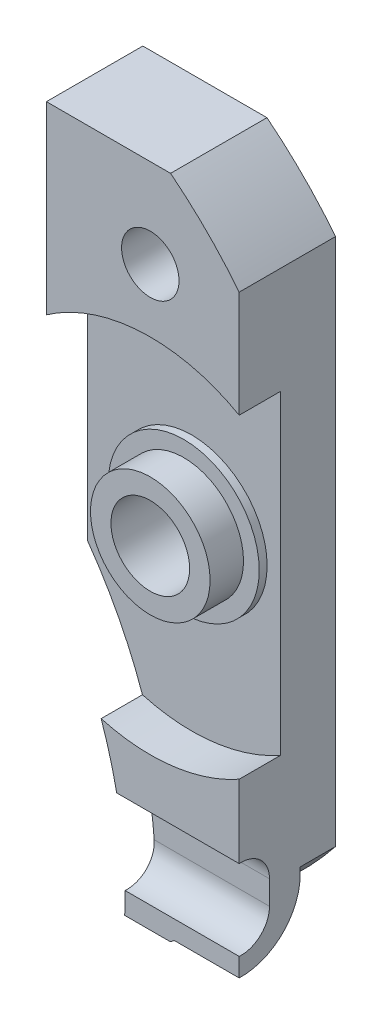
ISO-10303-21;
HEADER;
FILE_DESCRIPTION(('STEP AP214'),'2;1');
FILE_NAME('part.step','',(''),(''),'','','');
FILE_SCHEMA(('AUTOMOTIVE_DESIGN { 1 0 10303 214 1 1 1 1 }'));
ENDSEC;
DATA;
#1=APPLICATION_CONTEXT('core data for automotive mechanical design processes');
#2=APPLICATION_PROTOCOL_DEFINITION('international standard','automotive_design',2000,#1);
#3=PRODUCT_CONTEXT('',#1,'mechanical');
#4=PRODUCT('Part','Part','',(#3));
#5=PRODUCT_RELATED_PRODUCT_CATEGORY('part','',(#4));
#6=PRODUCT_DEFINITION_FORMATION('','',#4);
#7=PRODUCT_DEFINITION_CONTEXT('part definition',#1,'design');
#8=PRODUCT_DEFINITION('design','',#6,#7);
#9=PRODUCT_DEFINITION_SHAPE('','',#8);
#10=(LENGTH_UNIT() NAMED_UNIT(*) SI_UNIT(.MILLI.,.METRE.));
#11=(NAMED_UNIT(*) PLANE_ANGLE_UNIT() SI_UNIT($,.RADIAN.));
#12=(NAMED_UNIT(*) SI_UNIT($,.STERADIAN.) SOLID_ANGLE_UNIT());
#13=UNCERTAINTY_MEASURE_WITH_UNIT(LENGTH_MEASURE(1.E-05),#10,'distance_accuracy_value','');
#14=(GEOMETRIC_REPRESENTATION_CONTEXT(3) GLOBAL_UNCERTAINTY_ASSIGNED_CONTEXT((#13)) GLOBAL_UNIT_ASSIGNED_CONTEXT((#10,
#11,#12)) REPRESENTATION_CONTEXT('',''));
#15=CARTESIAN_POINT('',(0.,0.,0.));
#16=DIRECTION('',(0.,0.,1.));
#17=DIRECTION('',(1.,0.,0.));
#18=AXIS2_PLACEMENT_3D('',#15,#16,#17);
#19=CARTESIAN_POINT('',(0.,0.,6.125));
#20=DIRECTION('',(0.,0.,-1.));
#21=DIRECTION('',(-1.,0.,0.));
#22=AXIS2_PLACEMENT_3D('',#19,#20,#21);
#23=PLANE('',#22);
#24=DIRECTION('',(0.,1.,0.));
#25=VECTOR('',#24,1.);
#26=CARTESIAN_POINT('',(6.125,-21.15,6.125));
#27=LINE('',#26,#25);
#28=CARTESIAN_POINT('',(6.125,-20.9578977025192,6.125));
#29=VERTEX_POINT('',#28);
#30=CARTESIAN_POINT('',(6.125,-19.7692260916635,6.125));
#31=VERTEX_POINT('',#30);
#32=EDGE_CURVE('E281',#29,#31,#27,.T.);
#33=ORIENTED_EDGE('',*,*,#32,.T.);
#34=DIRECTION('',(1.,0.,0.));
#35=VECTOR('',#34,1.);
#36=CARTESIAN_POINT('',(-6.125,-19.7692260916635,6.125));
#37=LINE('',#36,#35);
#38=CARTESIAN_POINT('',(-1.12839404484273,-19.7692260916635,6.125));
#39=VERTEX_POINT('',#38);
#40=EDGE_CURVE('E155',#31,#39,#37,.F.);
#41=ORIENTED_EDGE('',*,*,#40,.T.);
#42=CARTESIAN_POINT('',(-28.1274,-20.00091,6.125));
#43=DIRECTION('',(0.,0.,1.));
#44=DIRECTION('',(1.,0.,0.));
#45=AXIS2_PLACEMENT_3D('',#42,#43,#44);
#46=CIRCLE('',#45,27.);
#47=CARTESIAN_POINT('',(-1.15186307908034,-21.15,6.125));
#48=VERTEX_POINT('',#47);
#49=EDGE_CURVE('E306',#48,#39,#46,.T.);
#50=ORIENTED_EDGE('',*,*,#49,.F.);
#51=DIRECTION('',(1.,0.,0.));
#52=VECTOR('',#51,1.);
#53=CARTESIAN_POINT('',(-6.125,-21.15,6.125));
#54=LINE('',#53,#52);
#55=CARTESIAN_POINT('',(1.75745757507034,-21.15,6.125));
#56=VERTEX_POINT('',#55);
#57=EDGE_CURVE('E276',#48,#56,#54,.T.);
#58=ORIENTED_EDGE('',*,*,#57,.T.);
#59=CARTESIAN_POINT('',(-15.0221,0.00292999999999433,6.125));
#60=DIRECTION('',(0.,0.,-1.));
#61=DIRECTION('',(1.,0.,0.));
#62=AXIS2_PLACEMENT_3D('',#59,#60,#61);
#63=CIRCLE('',#62,27.);
#64=CARTESIAN_POINT('',(1.9968218819908,-20.9578977025192,6.125));
#65=VERTEX_POINT('',#64);
#66=EDGE_CURVE('E355',#65,#56,#63,.T.);
#67=ORIENTED_EDGE('',*,*,#66,.F.);
#68=DIRECTION('',(1.,0.,0.));
#69=VECTOR('',#68,1.);
#70=CARTESIAN_POINT('',(-500000.,-20.9578977025192,6.125));
#71=LINE('',#70,#69);
#72=EDGE_CURVE('E183',#65,#29,#71,.T.);
#73=ORIENTED_EDGE('',*,*,#72,.T.);
#74=EDGE_LOOP('',(#33,#41,#50,#58,#67,#73));
#75=FACE_BOUND('',#74,.T.);
#76=ADVANCED_FACE('F32',(#75),#23,.F.);
#77=CARTESIAN_POINT('',(0.474999999999999,0.,4.));
#78=DIRECTION('',(0.,0.,1.));
#79=DIRECTION('',(1.,0.,0.));
#80=AXIS2_PLACEMENT_3D('',#77,#78,#79);
#81=PLANE('',#80);
#82=CARTESIAN_POINT('',(0.474999999999999,0.,4.));
#83=DIRECTION('',(0.,0.,1.));
#84=DIRECTION('',(1.,0.,0.));
#85=AXIS2_PLACEMENT_3D('',#82,#83,#84);
#86=CIRCLE('',#85,4.8);
#87=CARTESIAN_POINT('',(5.275,0.,4.));
#88=VERTEX_POINT('',#87);
#89=EDGE_CURVE('E394',#88,#88,#86,.T.);
#90=ORIENTED_EDGE('',*,*,#89,.T.);
#91=EDGE_LOOP('',(#90));
#92=FACE_BOUND('',#91,.T.);
#93=CARTESIAN_POINT('',(0.474999999999999,0.,4.));
#94=DIRECTION('',(0.,0.,1.));
#95=DIRECTION('',(1.,0.,0.));
#96=AXIS2_PLACEMENT_3D('',#93,#94,#95);
#97=CIRCLE('',#96,3.8);
#98=CARTESIAN_POINT('',(4.275,0.,4.));
#99=VERTEX_POINT('',#98);
#100=EDGE_CURVE('E387',#99,#99,#97,.T.);
#101=ORIENTED_EDGE('',*,*,#100,.F.);
#102=EDGE_LOOP('',(#101));
#103=FACE_BOUND('',#102,.T.);
#104=ADVANCED_FACE('F246',(#92,#103),#81,.T.);
#105=CARTESIAN_POINT('',(0.474999999999999,0.,3.5));
#106=DIRECTION('',(0.,0.,1.));
#107=DIRECTION('',(1.,0.,0.));
#108=AXIS2_PLACEMENT_3D('',#105,#106,#107);
#109=PLANE('',#108);
#110=DIRECTION('',(0.,1.,0.));
#111=VECTOR('',#110,1.);
#112=CARTESIAN_POINT('',(6.125,-21.15,3.5));
#113=LINE('',#112,#111);
#114=CARTESIAN_POINT('',(6.125,-10.0163616148779,3.5));
#115=VERTEX_POINT('',#114);
#116=CARTESIAN_POINT('',(6.125,10.0163616148779,3.5));
#117=VERTEX_POINT('',#116);
#118=EDGE_CURVE('E365',#115,#117,#113,.T.);
#119=ORIENTED_EDGE('',*,*,#118,.T.);
#120=CARTESIAN_POINT('',(0.474999999999999,0.,3.5));
#121=DIRECTION('',(0.,0.,1.));
#122=DIRECTION('',(1.,0.,0.));
#123=AXIS2_PLACEMENT_3D('',#120,#121,#122);
#124=CIRCLE('',#123,11.5);
#125=CARTESIAN_POINT('',(-6.125,9.4175368329516,3.5));
#126=VERTEX_POINT('',#125);
#127=EDGE_CURVE('E366',#117,#126,#124,.T.);
#128=ORIENTED_EDGE('',*,*,#127,.T.);
#129=DIRECTION('',(0.,-1.,0.));
#130=VECTOR('',#129,1.);
#131=CARTESIAN_POINT('',(-6.125,-21.15,3.5));
#132=LINE('',#131,#130);
#133=CARTESIAN_POINT('',(-6.125,-4.35180797336603,3.5));
#134=VERTEX_POINT('',#133);
#135=EDGE_CURVE('E362',#126,#134,#132,.T.);
#136=ORIENTED_EDGE('',*,*,#135,.T.);
#137=CARTESIAN_POINT('',(-28.1274,-20.00091,3.5));
#138=DIRECTION('',(0.,0.,1.));
#139=DIRECTION('',(1.,0.,0.));
#140=AXIS2_PLACEMENT_3D('',#137,#138,#139);
#141=CIRCLE('',#140,27.);
#142=CARTESIAN_POINT('',(-2.64799421793108,-11.0678320873949,3.5));
#143=VERTEX_POINT('',#142);
#144=EDGE_CURVE('E298',#134,#143,#141,.F.);
#145=ORIENTED_EDGE('',*,*,#144,.T.);
#146=EDGE_CURVE('E369',#143,#115,#124,.T.);
#147=ORIENTED_EDGE('',*,*,#146,.T.);
#148=EDGE_LOOP('',(#119,#128,#136,#145,#147));
#149=FACE_BOUND('',#148,.T.);
#150=CARTESIAN_POINT('',(0.474999999999999,0.,3.5));
#151=DIRECTION('',(0.,0.,1.));
#152=DIRECTION('',(1.,0.,0.));
#153=AXIS2_PLACEMENT_3D('',#150,#151,#152);
#154=CIRCLE('',#153,4.8);
#155=CARTESIAN_POINT('',(5.275,0.,3.5));
#156=VERTEX_POINT('',#155);
#157=EDGE_CURVE('E391',#156,#156,#154,.T.);
#158=ORIENTED_EDGE('',*,*,#157,.F.);
#159=EDGE_LOOP('',(#158));
#160=FACE_BOUND('',#159,.T.);
#161=ADVANCED_FACE('F251',(#149,#160),#109,.T.);
#162=CARTESIAN_POINT('',(0.474999999999999,15.5,6.125));
#163=DIRECTION('',(0.,0.,1.));
#164=DIRECTION('',(1.,0.,0.));
#165=AXIS2_PLACEMENT_3D('',#162,#163,#164);
#166=CIRCLE('',#165,1.825);
#167=CARTESIAN_POINT('',(2.3,15.5,6.125));
#168=VERTEX_POINT('',#167);
#169=EDGE_CURVE('E264',#168,#168,#166,.T.);
#170=ORIENTED_EDGE('',*,*,#169,.F.);
#171=EDGE_LOOP('',(#170));
#172=FACE_BOUND('',#171,.T.);
#173=DIRECTION('',(0.,-1.,0.));
#174=VECTOR('',#173,1.);
#175=CARTESIAN_POINT('',(-6.125,-21.15,6.125));
#176=LINE('',#175,#174);
#177=CARTESIAN_POINT('',(-6.125,21.15,6.125));
#178=VERTEX_POINT('',#177);
#179=CARTESIAN_POINT('',(-6.125,9.4175368329516,6.125));
#180=VERTEX_POINT('',#179);
#181=EDGE_CURVE('E268',#178,#180,#176,.T.);
#182=ORIENTED_EDGE('',*,*,#181,.T.);
#183=CARTESIAN_POINT('',(0.474999999999999,0.,6.125));
#184=DIRECTION('',(0.,0.,1.));
#185=DIRECTION('',(1.,0.,0.));
#186=AXIS2_PLACEMENT_3D('',#183,#184,#185);
#187=CIRCLE('',#186,11.5);
#188=CARTESIAN_POINT('',(6.125,10.0163616148779,6.125));
#189=VERTEX_POINT('',#188);
#190=EDGE_CURVE('E269',#189,#180,#187,.T.);
#191=ORIENTED_EDGE('',*,*,#190,.F.);
#192=CARTESIAN_POINT('',(6.125,16.7898344671732,6.125));
#193=VERTEX_POINT('',#192);
#194=EDGE_CURVE('E296',#189,#193,#27,.T.);
#195=ORIENTED_EDGE('',*,*,#194,.T.);
#196=CARTESIAN_POINT('',(-15.0221,0.00292999999999433,6.125));
#197=DIRECTION('',(0.,0.,-1.));
#198=DIRECTION('',(1.,0.,0.));
#199=AXIS2_PLACEMENT_3D('',#196,#197,#198);
#200=CIRCLE('',#199,27.);
#201=CARTESIAN_POINT('',(1.76484225924125,21.15,6.125));
#202=VERTEX_POINT('',#201);
#203=EDGE_CURVE('E316',#202,#193,#200,.T.);
#204=ORIENTED_EDGE('',*,*,#203,.F.);
#205=DIRECTION('',(-1.,0.,0.));
#206=VECTOR('',#205,1.);
#207=CARTESIAN_POINT('',(-6.125,21.15,6.125));
#208=LINE('',#207,#206);
#209=EDGE_CURVE('E272',#202,#178,#208,.T.);
#210=ORIENTED_EDGE('',*,*,#209,.T.);
#211=EDGE_LOOP('',(#182,#191,#195,#204,#210));
#212=FACE_BOUND('',#211,.T.);
#213=ADVANCED_FACE('F219',(#172,#212),#23,.F.);
#214=CARTESIAN_POINT('',(0.474999999999999,0.,0.));
#215=DIRECTION('',(0.,0.,1.));
#216=DIRECTION('',(1.,0.,0.));
#217=AXIS2_PLACEMENT_3D('',#214,#215,#216);
#218=CYLINDRICAL_SURFACE('',#217,2.5);
#219=CARTESIAN_POINT('',(0.474999999999999,0.,0.));
#220=DIRECTION('',(0.,0.,1.));
#221=DIRECTION('',(1.,0.,0.));
#222=AXIS2_PLACEMENT_3D('',#219,#220,#221);
#223=CIRCLE('',#222,2.5);
#224=CARTESIAN_POINT('',(2.975,0.,0.));
#225=VERTEX_POINT('',#224);
#226=EDGE_CURVE('E341',#225,#225,#223,.T.);
#227=ORIENTED_EDGE('',*,*,#226,.F.);
#228=EDGE_LOOP('',(#227));
#229=FACE_BOUND('',#228,.T.);
#230=CARTESIAN_POINT('',(0.474999999999999,0.,6.125));
#231=DIRECTION('',(0.,0.,1.));
#232=DIRECTION('',(1.,0.,0.));
#233=AXIS2_PLACEMENT_3D('',#230,#231,#232);
#234=CIRCLE('',#233,2.5);
#235=CARTESIAN_POINT('',(2.975,0.,6.125));
#236=VERTEX_POINT('',#235);
#237=EDGE_CURVE('E383',#236,#236,#234,.T.);
#238=ORIENTED_EDGE('',*,*,#237,.T.);
#239=EDGE_LOOP('',(#238));
#240=FACE_BOUND('',#239,.T.);
#241=ADVANCED_FACE('F214',(#229,#240),#218,.F.);
#242=CARTESIAN_POINT('',(-1.66014576906151,-14.6638271380924,6.125));
#243=VERTEX_POINT('',#242);
#244=CARTESIAN_POINT('',(-2.64799421793108,-11.0678320873949,6.125));
#245=VERTEX_POINT('',#244);
#246=EDGE_CURVE('E330',#243,#245,#46,.T.);
#247=ORIENTED_EDGE('',*,*,#246,.F.);
#248=DIRECTION('',(1.,0.,0.));
#249=VECTOR('',#248,1.);
#250=CARTESIAN_POINT('',(-6.125,-14.6638271380924,6.125));
#251=LINE('',#250,#249);
#252=CARTESIAN_POINT('',(6.125,-14.6638271380924,6.125));
#253=VERTEX_POINT('',#252);
#254=EDGE_CURVE('E171',#243,#253,#251,.T.);
#255=ORIENTED_EDGE('',*,*,#254,.T.);
#256=CARTESIAN_POINT('',(6.125,-10.0163616148779,6.125));
#257=VERTEX_POINT('',#256);
#258=EDGE_CURVE('E313',#253,#257,#27,.T.);
#259=ORIENTED_EDGE('',*,*,#258,.T.);
#260=EDGE_CURVE('E397',#245,#257,#187,.T.);
#261=ORIENTED_EDGE('',*,*,#260,.F.);
#262=EDGE_LOOP('',(#247,#255,#259,#261));
#263=FACE_BOUND('',#262,.T.);
#264=ADVANCED_FACE('F218',(#263),#23,.F.);
#265=CARTESIAN_POINT('',(0.,0.,0.));
#266=DIRECTION('',(0.,0.,-1.));
#267=DIRECTION('',(-1.,0.,0.));
#268=AXIS2_PLACEMENT_3D('',#265,#266,#267);
#269=PLANE('',#268);
#270=CARTESIAN_POINT('',(0.474999999999999,15.5,0.));
#271=DIRECTION('',(0.,0.,1.));
#272=DIRECTION('',(1.,0.,0.));
#273=AXIS2_PLACEMENT_3D('',#270,#271,#272);
#274=CIRCLE('',#273,1.825);
#275=CARTESIAN_POINT('',(2.3,15.5,0.));
#276=VERTEX_POINT('',#275);
#277=EDGE_CURVE('E288',#276,#276,#274,.T.);
#278=ORIENTED_EDGE('',*,*,#277,.T.);
#279=EDGE_LOOP('',(#278));
#280=FACE_BOUND('',#279,.T.);
#281=ORIENTED_EDGE('',*,*,#226,.T.);
#282=EDGE_LOOP('',(#281));
#283=FACE_BOUND('',#282,.T.);
#284=CARTESIAN_POINT('',(-15.0221,0.00292999999999433,0.));
#285=DIRECTION('',(0.,0.,-1.));
#286=DIRECTION('',(1.,0.,0.));
#287=AXIS2_PLACEMENT_3D('',#284,#285,#286);
#288=CIRCLE('',#287,27.);
#289=CARTESIAN_POINT('',(6.12499999999999,-16.7839744671732,0.));
#290=VERTEX_POINT('',#289);
#291=CARTESIAN_POINT('',(1.75745757507034,-21.15,0.));
#292=VERTEX_POINT('',#291);
#293=EDGE_CURVE('E354',#290,#292,#288,.T.);
#294=ORIENTED_EDGE('',*,*,#293,.T.);
#295=DIRECTION('',(1.,0.,0.));
#296=VECTOR('',#295,1.);
#297=CARTESIAN_POINT('',(-6.125,-21.15,0.));
#298=LINE('',#297,#296);
#299=CARTESIAN_POINT('',(-1.15186307908034,-21.15,0.));
#300=VERTEX_POINT('',#299);
#301=EDGE_CURVE('E293',#300,#292,#298,.T.);
#302=ORIENTED_EDGE('',*,*,#301,.F.);
#303=CARTESIAN_POINT('',(-28.1274,-20.00091,0.));
#304=DIRECTION('',(0.,0.,1.));
#305=DIRECTION('',(1.,0.,0.));
#306=AXIS2_PLACEMENT_3D('',#303,#304,#305);
#307=CIRCLE('',#306,27.);
#308=CARTESIAN_POINT('',(-6.125,-4.35180797336603,0.));
#309=VERTEX_POINT('',#308);
#310=EDGE_CURVE('E334',#300,#309,#307,.T.);
#311=ORIENTED_EDGE('',*,*,#310,.T.);
#312=DIRECTION('',(0.,-1.,0.));
#313=VECTOR('',#312,1.);
#314=CARTESIAN_POINT('',(-6.125,-21.15,0.));
#315=LINE('',#314,#313);
#316=CARTESIAN_POINT('',(-6.125,21.15,0.));
#317=VERTEX_POINT('',#316);
#318=EDGE_CURVE('E290',#317,#309,#315,.T.);
#319=ORIENTED_EDGE('',*,*,#318,.F.);
#320=DIRECTION('',(-1.,0.,0.));
#321=VECTOR('',#320,1.);
#322=CARTESIAN_POINT('',(-6.125,21.15,0.));
#323=LINE('',#322,#321);
#324=CARTESIAN_POINT('',(1.76484225924125,21.15,0.));
#325=VERTEX_POINT('',#324);
#326=EDGE_CURVE('E287',#325,#317,#323,.T.);
#327=ORIENTED_EDGE('',*,*,#326,.F.);
#328=CARTESIAN_POINT('',(-15.0221,0.00292999999999433,0.));
#329=DIRECTION('',(0.,0.,-1.));
#330=DIRECTION('',(1.,0.,0.));
#331=AXIS2_PLACEMENT_3D('',#328,#329,#330);
#332=CIRCLE('',#331,27.);
#333=CARTESIAN_POINT('',(6.125,16.7898344671732,0.));
#334=VERTEX_POINT('',#333);
#335=EDGE_CURVE('E325',#325,#334,#332,.T.);
#336=ORIENTED_EDGE('',*,*,#335,.T.);
#337=DIRECTION('',(0.,1.,0.));
#338=VECTOR('',#337,1.);
#339=CARTESIAN_POINT('',(6.125,-21.15,0.));
#340=LINE('',#339,#338);
#341=EDGE_CURVE('E285',#290,#334,#340,.T.);
#342=ORIENTED_EDGE('',*,*,#341,.F.);
#343=EDGE_LOOP('',(#294,#302,#311,#319,#327,#336,#342));
#344=FACE_BOUND('',#343,.T.);
#345=ADVANCED_FACE('F227',(#280,#283,#344),#269,.T.);
#346=CARTESIAN_POINT('',(6.125,-21.15,6.125));
#347=DIRECTION('',(-1.,0.,0.));
#348=DIRECTION('',(0.,0.,1.));
#349=AXIS2_PLACEMENT_3D('',#346,#347,#348);
#350=PLANE('',#349);
#351=DIRECTION('',(0.,1.,0.));
#352=VECTOR('',#351,1.);
#353=CARTESIAN_POINT('',(6.125,-17.9735716148779,4.2));
#354=LINE('',#353,#352);
#355=CARTESIAN_POINT('',(6.125,-17.9735716148779,4.2));
#356=VERTEX_POINT('',#355);
#357=CARTESIAN_POINT('',(6.125,-16.4594816148779,4.2));
#358=VERTEX_POINT('',#357);
#359=EDGE_CURVE('E159',#356,#358,#354,.T.);
#360=ORIENTED_EDGE('',*,*,#359,.F.);
#361=CARTESIAN_POINT('',(6.125,-17.9735716148779,6.));
#362=DIRECTION('',(1.,0.,0.));
#363=DIRECTION('',(0.,0.,-1.));
#364=AXIS2_PLACEMENT_3D('',#361,#362,#363);
#365=CIRCLE('',#364,1.8);
#366=EDGE_CURVE('E150',#31,#356,#365,.T.);
#367=ORIENTED_EDGE('',*,*,#366,.F.);
#368=ORIENTED_EDGE('',*,*,#32,.F.);
#369=CARTESIAN_POINT('',(6.125,-17.2099816148779,6.));
#370=DIRECTION('',(1.,0.,0.));
#371=DIRECTION('',(0.,0.,-1.));
#372=AXIS2_PLACEMENT_3D('',#369,#370,#371);
#373=CIRCLE('',#372,3.75);
#374=CARTESIAN_POINT('',(6.12499999999999,-16.7839744671732,2.27427618977138));
#375=VERTEX_POINT('',#374);
#376=EDGE_CURVE('E184',#29,#375,#373,.T.);
#377=ORIENTED_EDGE('',*,*,#376,.T.);
#378=DIRECTION('',(0.,0.,1.));
#379=VECTOR('',#378,1.);
#380=CARTESIAN_POINT('',(6.12499999999999,-16.7839744671732,0.));
#381=LINE('',#380,#379);
#382=EDGE_CURVE('E60',#290,#375,#381,.T.);
#383=ORIENTED_EDGE('',*,*,#382,.F.);
#384=ORIENTED_EDGE('',*,*,#341,.T.);
#385=DIRECTION('',(0.,0.,1.));
#386=VECTOR('',#385,1.);
#387=CARTESIAN_POINT('',(6.125,16.7898344671732,0.));
#388=LINE('',#387,#386);
#389=EDGE_CURVE('E321',#334,#193,#388,.T.);
#390=ORIENTED_EDGE('',*,*,#389,.T.);
#391=ORIENTED_EDGE('',*,*,#194,.F.);
#392=DIRECTION('',(0.,0.,1.));
#393=VECTOR('',#392,1.);
#394=CARTESIAN_POINT('',(6.125,10.0163616148779,3.5));
#395=LINE('',#394,#393);
#396=EDGE_CURVE('E374',#189,#117,#395,.F.);
#397=ORIENTED_EDGE('',*,*,#396,.T.);
#398=ORIENTED_EDGE('',*,*,#118,.F.);
#399=DIRECTION('',(0.,0.,1.));
#400=VECTOR('',#399,1.);
#401=CARTESIAN_POINT('',(6.125,-10.0163616148779,3.5));
#402=LINE('',#401,#400);
#403=EDGE_CURVE('E376',#115,#257,#402,.T.);
#404=ORIENTED_EDGE('',*,*,#403,.T.);
#405=ORIENTED_EDGE('',*,*,#258,.F.);
#406=CARTESIAN_POINT('',(6.125,-16.4594816148779,6.));
#407=DIRECTION('',(1.,0.,0.));
#408=DIRECTION('',(0.,0.,-1.));
#409=AXIS2_PLACEMENT_3D('',#406,#407,#408);
#410=CIRCLE('',#409,1.8);
#411=EDGE_CURVE('E165',#358,#253,#410,.T.);
#412=ORIENTED_EDGE('',*,*,#411,.F.);
#413=EDGE_LOOP('',(#360,#367,#368,#377,#383,#384,#390,#391,#397,#398,#404,#405,#412));
#414=FACE_BOUND('',#413,.T.);
#415=ADVANCED_FACE('F34',(#414),#350,.F.);
#416=CARTESIAN_POINT('',(-6.125,21.15,6.125));
#417=DIRECTION('',(0.,-1.,0.));
#418=DIRECTION('',(0.,0.,-1.));
#419=AXIS2_PLACEMENT_3D('',#416,#417,#418);
#420=PLANE('',#419);
#421=ORIENTED_EDGE('',*,*,#209,.F.);
#422=DIRECTION('',(0.,0.,1.));
#423=VECTOR('',#422,1.);
#424=CARTESIAN_POINT('',(1.76484225924125,21.15,0.));
#425=LINE('',#424,#423);
#426=EDGE_CURVE('E324',#325,#202,#425,.T.);
#427=ORIENTED_EDGE('',*,*,#426,.F.);
#428=ORIENTED_EDGE('',*,*,#326,.T.);
#429=DIRECTION('',(0.,0.,-1.));
#430=VECTOR('',#429,1.);
#431=CARTESIAN_POINT('',(-6.125,21.15,6.125));
#432=LINE('',#431,#430);
#433=EDGE_CURVE('E279',#178,#317,#432,.T.);
#434=ORIENTED_EDGE('',*,*,#433,.F.);
#435=EDGE_LOOP('',(#421,#427,#428,#434));
#436=FACE_BOUND('',#435,.T.);
#437=ADVANCED_FACE('F237',(#436),#420,.F.);
#438=CARTESIAN_POINT('',(-6.125,-21.15,6.125));
#439=DIRECTION('',(1.,0.,0.));
#440=DIRECTION('',(0.,0.,-1.));
#441=AXIS2_PLACEMENT_3D('',#438,#439,#440);
#442=PLANE('',#441);
#443=ORIENTED_EDGE('',*,*,#135,.F.);
#444=DIRECTION('',(0.,0.,1.));
#445=VECTOR('',#444,1.);
#446=CARTESIAN_POINT('',(-6.125,9.41753683295159,3.5));
#447=LINE('',#446,#445);
#448=EDGE_CURVE('E363',#126,#180,#447,.T.);
#449=ORIENTED_EDGE('',*,*,#448,.T.);
#450=ORIENTED_EDGE('',*,*,#181,.F.);
#451=ORIENTED_EDGE('',*,*,#433,.T.);
#452=ORIENTED_EDGE('',*,*,#318,.T.);
#453=DIRECTION('',(0.,0.,1.));
#454=VECTOR('',#453,1.);
#455=CARTESIAN_POINT('',(-6.125,-4.35180797336603,0.));
#456=LINE('',#455,#454);
#457=EDGE_CURVE('E337',#309,#134,#456,.T.);
#458=ORIENTED_EDGE('',*,*,#457,.T.);
#459=EDGE_LOOP('',(#443,#449,#450,#451,#452,#458));
#460=FACE_BOUND('',#459,.T.);
#461=ADVANCED_FACE('F234',(#460),#442,.F.);
#462=CARTESIAN_POINT('',(-6.125,-21.15,6.125));
#463=DIRECTION('',(0.,1.,0.));
#464=DIRECTION('',(0.,0.,1.));
#465=AXIS2_PLACEMENT_3D('',#462,#463,#464);
#466=PLANE('',#465);
#467=ORIENTED_EDGE('',*,*,#301,.T.);
#468=DIRECTION('',(0.,0.,1.));
#469=VECTOR('',#468,1.);
#470=CARTESIAN_POINT('',(1.75745757507034,-21.15,0.));
#471=LINE('',#470,#469);
#472=EDGE_CURVE('E326',#292,#56,#471,.T.);
#473=ORIENTED_EDGE('',*,*,#472,.T.);
#474=ORIENTED_EDGE('',*,*,#57,.F.);
#475=DIRECTION('',(0.,0.,1.));
#476=VECTOR('',#475,1.);
#477=CARTESIAN_POINT('',(-1.15186307908034,-21.15,0.));
#478=LINE('',#477,#476);
#479=EDGE_CURVE('E339',#300,#48,#478,.T.);
#480=ORIENTED_EDGE('',*,*,#479,.F.);
#481=EDGE_LOOP('',(#467,#473,#474,#480));
#482=FACE_BOUND('',#481,.T.);
#483=ADVANCED_FACE('F223',(#482),#466,.F.);
#484=CARTESIAN_POINT('',(0.474999999999999,15.5,0.));
#485=DIRECTION('',(0.,0.,1.));
#486=DIRECTION('',(1.,0.,0.));
#487=AXIS2_PLACEMENT_3D('',#484,#485,#486);
#488=CYLINDRICAL_SURFACE('',#487,1.825);
#489=ORIENTED_EDGE('',*,*,#277,.F.);
#490=EDGE_LOOP('',(#489));
#491=FACE_BOUND('',#490,.T.);
#492=ORIENTED_EDGE('',*,*,#169,.T.);
#493=EDGE_LOOP('',(#492));
#494=FACE_BOUND('',#493,.T.);
#495=ADVANCED_FACE('F211',(#491,#494),#488,.F.);
#496=CARTESIAN_POINT('',(-28.1274,-20.00091,0.));
#497=DIRECTION('',(0.,0.,1.));
#498=DIRECTION('',(1.,0.,0.));
#499=AXIS2_PLACEMENT_3D('',#496,#497,#498);
#500=CYLINDRICAL_SURFACE('',#499,27.);
#501=ORIENTED_EDGE('',*,*,#49,.T.);
#502=CARTESIAN_POINT('',(-1.12839404484273,-19.7692260916635,6.125));
#503=CARTESIAN_POINT('',(-1.12836468523779,-19.7727423271805,6.07448361741428));
#504=CARTESIAN_POINT('',(-1.12835259861897,-19.7741244790836,6.0238429829901));
#505=CARTESIAN_POINT('',(-1.12836496354081,-19.772620756701,5.92262760509678));
#506=CARTESIAN_POINT('',(-1.12838941333959,-19.7697350858843,5.87205285860149));
#507=CARTESIAN_POINT('',(-1.12852040730474,-19.7546935341504,5.72106023329648));
#508=CARTESIAN_POINT('',(-1.12868448475947,-19.7361648468294,5.62120296001102));
#509=CARTESIAN_POINT('',(-1.12926323241391,-19.6826083843364,5.42601944302459));
#510=CARTESIAN_POINT('',(-1.12967802255062,-19.6475727142552,5.3306953915026));
#511=CARTESIAN_POINT('',(-1.13093390841361,-19.5620004981507,5.14728272619669));
#512=CARTESIAN_POINT('',(-1.13177494586212,-19.5114660715355,5.05919312521032));
#513=CARTESIAN_POINT('',(-1.13410826237511,-19.3963412889076,4.89276685935568));
#514=CARTESIAN_POINT('',(-1.13560045231845,-19.3317528570272,4.81442886170233));
#515=CARTESIAN_POINT('',(-1.1394769879981,-19.1903535289904,4.66970851410882));
#516=CARTESIAN_POINT('',(-1.14186137872091,-19.1135420166345,4.60332676727648));
#517=CARTESIAN_POINT('',(-1.1477377952291,-18.9499540104035,4.4844488526092));
#518=CARTESIAN_POINT('',(-1.15122910614885,-18.8631839709046,4.43194376303778));
#519=CARTESIAN_POINT('',(-1.15947480247121,-18.6821147221219,4.34223864825988));
#520=CARTESIAN_POINT('',(-1.16422906076177,-18.587816271219,4.30503708375706));
#521=CARTESIAN_POINT('',(-1.17434344688481,-18.4072465188998,4.25083100342185));
#522=CARTESIAN_POINT('',(-1.17953994763253,-18.321566078642,4.23180415038519));
#523=CARTESIAN_POINT('',(-1.19088084155929,-18.1484446161317,4.20636912899963));
#524=CARTESIAN_POINT('',(-1.19702491300145,-18.0610042001886,4.19995668769799));
#525=CARTESIAN_POINT('',(-1.20362056485735,-17.9735716148779,4.2));
#526=B_SPLINE_CURVE_WITH_KNOTS('',3,(#502,#503,#504,#505,#506,#507,#508,#509,#510,#511,#512,
#513,#514,#515,#516,#517,#518,#519,#520,#521,#522,#523,#524,#525),.UNSPECIFIED.,.F.,.F.,(4,2,2,
2,2,2,2,2,2,2,2,4),(0.,0.151822550743533,0.30363786355709,0.606760801709585,0.91002886397382,
1.21325547372495,1.51644059484654,1.8196410052204,2.12264600173257,2.42562051320342,
2.68846999797354,2.95123043087344),.UNSPECIFIED.);
#527=CARTESIAN_POINT('',(-1.20362056485735,-17.9735716148779,4.2));
#528=VERTEX_POINT('',#527);
#529=EDGE_CURVE('E11',#39,#528,#526,.T.);
#530=ORIENTED_EDGE('',*,*,#529,.T.);
#531=CARTESIAN_POINT('',(-28.1274,-20.00091,4.2));
#532=DIRECTION('',(0.,0.,-1.));
#533=DIRECTION('',(-1.,0.,0.));
#534=AXIS2_PLACEMENT_3D('',#531,#532,#533);
#535=CIRCLE('',#534,27.);
#536=CARTESIAN_POINT('',(-1.36066159217281,-16.4594816148779,4.2));
#537=VERTEX_POINT('',#536);
#538=EDGE_CURVE('E164',#528,#537,#535,.F.);
#539=ORIENTED_EDGE('',*,*,#538,.T.);
#540=CARTESIAN_POINT('',(-1.36066159217281,-16.4594816148779,4.2));
#541=CARTESIAN_POINT('',(-1.36743443476973,-16.4082849394296,4.20000050945285));
#542=CARTESIAN_POINT('',(-1.37435265720631,-16.3571331794992,4.20218553629452));
#543=CARTESIAN_POINT('',(-1.38842889208684,-16.2552374451931,4.21089364298526));
#544=CARTESIAN_POINT('',(-1.39558688621997,-16.2044934400435,4.21741639228605));
#545=CARTESIAN_POINT('',(-1.41732171188391,-16.0535046244858,4.24341660099212));
#546=CARTESIAN_POINT('',(-1.43218209179701,-15.9543318393543,4.26932624992695));
#547=CARTESIAN_POINT('',(-1.46206959720146,-15.761844916437,4.33754765316686));
#548=CARTESIAN_POINT('',(-1.47709677839701,-15.6685328096336,4.3798650574338));
#549=CARTESIAN_POINT('',(-1.50667362547277,-15.4903574826929,4.47972999157698));
#550=CARTESIAN_POINT('',(-1.52122333240336,-15.4054935349509,4.53727620829488));
#551=CARTESIAN_POINT('',(-1.54916074941558,-15.2465722720768,4.66608722529897));
#552=CARTESIAN_POINT('',(-1.56254753601156,-15.1725235141649,4.73736278626674));
#553=CARTESIAN_POINT('',(-1.58744732459213,-15.0374799480645,4.89165915017907));
#554=CARTESIAN_POINT('',(-1.59896030460619,-14.9764852929337,4.97468009081778));
#555=CARTESIAN_POINT('',(-1.61935113679612,-14.8699971248342,5.14919016288637));
#556=CARTESIAN_POINT('',(-1.62825581306413,-14.8243450517773,5.24057940965378));
#557=CARTESIAN_POINT('',(-1.64306712895558,-14.7490925787542,5.42996262930637));
#558=CARTESIAN_POINT('',(-1.64897488103332,-14.7194862223598,5.52795413611783));
#559=CARTESIAN_POINT('',(-1.65665011514835,-14.6811606667925,5.70928703548764));
#560=CARTESIAN_POINT('',(-1.65897835489362,-14.6696058640535,5.79201771878169));
#561=CARTESIAN_POINT('',(-1.66131756927444,-14.6580266589653,5.95829499631167));
#562=CARTESIAN_POINT('',(-1.66132903486258,-14.6579998137005,6.0418414139308));
#563=CARTESIAN_POINT('',(-1.66014576906151,-14.6638271380924,6.125));
#564=B_SPLINE_CURVE_WITH_KNOTS('',3,(#540,#541,#542,#543,#544,#545,#546,#547,#548,#549,#550,
#551,#552,#553,#554,#555,#556,#557,#558,#559,#560,#561,#562,#563),.UNSPECIFIED.,.F.,.F.,(4,2,2,
2,2,2,2,2,2,2,2,4),(0.,0.154831618248252,0.309651439185283,0.618779667777552,0.928014438430308,
1.23722255290178,1.54667400959078,1.85612909436039,2.16227995976017,2.46831709905364,
2.71820488610918,2.96803971885089),.UNSPECIFIED.);
#565=EDGE_CURVE('E45',#537,#243,#564,.T.);
#566=ORIENTED_EDGE('',*,*,#565,.T.);
#567=ORIENTED_EDGE('',*,*,#246,.T.);
#568=DIRECTION('',(0.,0.,1.));
#569=VECTOR('',#568,1.);
#570=CARTESIAN_POINT('',(-2.64799421793108,-11.0678320873949,4.8125));
#571=LINE('',#570,#569);
#572=EDGE_CURVE('E299',#245,#143,#571,.F.);
#573=ORIENTED_EDGE('',*,*,#572,.T.);
#574=ORIENTED_EDGE('',*,*,#144,.F.);
#575=ORIENTED_EDGE('',*,*,#457,.F.);
#576=ORIENTED_EDGE('',*,*,#310,.F.);
#577=ORIENTED_EDGE('',*,*,#479,.T.);
#578=EDGE_LOOP('',(#501,#530,#539,#566,#567,#573,#574,#575,#576,#577));
#579=FACE_BOUND('',#578,.T.);
#580=ADVANCED_FACE('F205',(#579),#500,.F.);
#581=CARTESIAN_POINT('',(-15.0221,0.00292999999999433,0.));
#582=DIRECTION('',(0.,0.,1.));
#583=DIRECTION('',(1.,0.,0.));
#584=AXIS2_PLACEMENT_3D('',#581,#582,#583);
#585=CYLINDRICAL_SURFACE('',#584,27.);
#586=ORIENTED_EDGE('',*,*,#203,.T.);
#587=ORIENTED_EDGE('',*,*,#389,.F.);
#588=ORIENTED_EDGE('',*,*,#335,.F.);
#589=ORIENTED_EDGE('',*,*,#426,.T.);
#590=EDGE_LOOP('',(#586,#587,#588,#589));
#591=FACE_BOUND('',#590,.T.);
#592=ADVANCED_FACE('F210',(#591),#585,.T.);
#593=CARTESIAN_POINT('',(-15.0221,0.00292999999999433,0.));
#594=DIRECTION('',(0.,0.,1.));
#595=DIRECTION('',(1.,0.,0.));
#596=AXIS2_PLACEMENT_3D('',#593,#594,#595);
#597=CYLINDRICAL_SURFACE('',#596,27.);
#598=ORIENTED_EDGE('',*,*,#382,.T.);
#599=CARTESIAN_POINT('',(1.99682188198066,-20.9578977025192,6.125));
#600=CARTESIAN_POINT('',(1.99357007505967,-20.9605333624522,6.04667419495819));
#601=CARTESIAN_POINT('',(1.99340386721451,-20.9606715553314,5.96815272474934));
#602=CARTESIAN_POINT('',(1.999092250886,-20.9560556412813,5.81155172736345));
#603=CARTESIAN_POINT('',(2.00494060566729,-20.9513066021107,5.73347182663964));
#604=CARTESIAN_POINT('',(2.02240166980221,-20.9371051702331,5.57930412189935));
#605=CARTESIAN_POINT('',(2.03394802081265,-20.9277069188323,5.50320375941824));
#606=CARTESIAN_POINT('',(2.0624103393658,-20.9044812537553,5.35271521169377));
#607=CARTESIAN_POINT('',(2.07932728097911,-20.8906530366066,5.2783273396739));
#608=CARTESIAN_POINT('',(2.13732788619733,-20.843089553219,5.05911519150355));
#609=CARTESIAN_POINT('',(2.18575362285708,-20.8032014966369,4.9174885609558));
#610=CARTESIAN_POINT('',(2.29820276145903,-20.7096862774843,4.64521330200561));
#611=CARTESIAN_POINT('',(2.36227487213549,-20.6560161826052,4.51460070353063));
#612=CARTESIAN_POINT('',(2.53811070693353,-20.5070199971614,4.20119635322974));
#613=CARTESIAN_POINT('',(2.65746527651433,-20.4044584670884,4.02606946591674));
#614=CARTESIAN_POINT('',(2.84893775500139,-20.2364714456808,3.78356673859471));
#615=CARTESIAN_POINT('',(2.91494263148054,-20.1780209805154,3.70599701271618));
#616=CARTESIAN_POINT('',(3.05028695135137,-20.0569065507579,3.55731741834708));
#617=CARTESIAN_POINT('',(3.11962554776533,-19.9942436547979,3.48620592217942));
#618=CARTESIAN_POINT('',(3.29161183836258,-19.8371002055344,3.32066091962211));
#619=CARTESIAN_POINT('',(3.39563006318687,-19.7406349554419,3.22953603023055));
#620=CARTESIAN_POINT('',(3.60730596384143,-19.5410312101852,3.05961074412604));
#621=CARTESIAN_POINT('',(3.71496516491478,-19.4378899013929,2.98081559222911));
#622=CARTESIAN_POINT('',(3.93271643392203,-19.225644476714,2.83516436223069));
#623=CARTESIAN_POINT('',(4.04281100901561,-19.1165340276364,2.76832129906158));
#624=CARTESIAN_POINT('',(4.26425920337667,-18.8931300789127,2.64654031086065));
#625=CARTESIAN_POINT('',(4.37561261803173,-18.7788374127466,2.59160047953254));
#626=CARTESIAN_POINT('',(4.60137511205718,-18.542865094941,2.49248178426125));
#627=CARTESIAN_POINT('',(4.71579397681118,-18.4210744913442,2.44858934126043));
#628=CARTESIAN_POINT('',(4.94425278477969,-18.1732402226541,2.3735143357991));
#629=CARTESIAN_POINT('',(5.05829264777535,-18.0471957132283,2.34233431280815));
#630=CARTESIAN_POINT('',(5.28487513444434,-17.7918954491031,2.2931510366383));
#631=CARTESIAN_POINT('',(5.39742107342386,-17.6626497523888,2.27511087319987));
#632=CARTESIAN_POINT('',(5.62058271418596,-17.4013550908061,2.25259293309242));
#633=CARTESIAN_POINT('',(5.73119898042565,-17.2693069716158,2.24811112195493));
#634=CARTESIAN_POINT('',(5.88845260695326,-17.0778932236917,2.2518712865774));
#635=CARTESIAN_POINT('',(5.93619380604007,-17.0192797361841,2.25438893206037));
#636=CARTESIAN_POINT('',(6.03106303272961,-16.9018037495795,2.26222152795261));
#637=CARTESIAN_POINT('',(6.0781914152857,-16.8429414234296,2.26753477771238));
#638=CARTESIAN_POINT('',(6.12499999988358,-16.7839744673199,2.2742761897546));
#639=B_SPLINE_CURVE_WITH_KNOTS('',3,(#599,#600,#601,#602,#603,#604,#605,#606,#607,#608,#609,
#610,#611,#612,#613,#614,#615,#616,#617,#618,#619,#620,#621,#622,#623,#624,#625,#626,#627,#628,
#629,#630,#631,#632,#633,#634,#635,#636,#637,#638),.UNSPECIFIED.,.F.,.F.,(4,2,2,2,2,2,2,2,2,2,2,
2,2,2,2,2,2,2,2,4),(0.,0.235189506009339,0.470135380473234,0.702407467286527,0.934721705662805,
1.39709392508036,1.86092432810159,2.56303706981115,2.91514045869024,3.26715485873038,
3.77227377187151,4.27760697147266,4.78348713385218,5.28928621980649,5.80709267979408,
6.3250025276665,6.84145188073568,7.35774754229132,7.58461558779014,7.81134578198038),.UNSPECIFIED.);
#640=EDGE_CURVE('E176',#65,#375,#639,.T.);
#641=ORIENTED_EDGE('',*,*,#640,.F.);
#642=ORIENTED_EDGE('',*,*,#66,.T.);
#643=ORIENTED_EDGE('',*,*,#472,.F.);
#644=ORIENTED_EDGE('',*,*,#293,.F.);
#645=EDGE_LOOP('',(#598,#641,#642,#643,#644));
#646=FACE_BOUND('',#645,.T.);
#647=ADVANCED_FACE('F381',(#646),#597,.T.);
#648=CARTESIAN_POINT('',(0.474999999999999,0.,3.5));
#649=DIRECTION('',(0.,0.,1.));
#650=DIRECTION('',(1.,0.,0.));
#651=AXIS2_PLACEMENT_3D('',#648,#649,#650);
#652=CYLINDRICAL_SURFACE('',#651,11.5);
#653=ORIENTED_EDGE('',*,*,#146,.F.);
#654=ORIENTED_EDGE('',*,*,#572,.F.);
#655=ORIENTED_EDGE('',*,*,#260,.T.);
#656=ORIENTED_EDGE('',*,*,#403,.F.);
#657=EDGE_LOOP('',(#653,#654,#655,#656));
#658=FACE_BOUND('',#657,.T.);
#659=ADVANCED_FACE('F414',(#658),#652,.F.);
#660=ORIENTED_EDGE('',*,*,#190,.T.);
#661=ORIENTED_EDGE('',*,*,#448,.F.);
#662=ORIENTED_EDGE('',*,*,#127,.F.);
#663=ORIENTED_EDGE('',*,*,#396,.F.);
#664=EDGE_LOOP('',(#660,#661,#662,#663));
#665=FACE_BOUND('',#664,.T.);
#666=ADVANCED_FACE('F405',(#665),#652,.F.);
#667=CARTESIAN_POINT('',(0.474999999999999,0.,4.));
#668=DIRECTION('',(0.,0.,-1.));
#669=DIRECTION('',(-1.,0.,0.));
#670=AXIS2_PLACEMENT_3D('',#667,#668,#669);
#671=CYLINDRICAL_SURFACE('',#670,4.8);
#672=ORIENTED_EDGE('',*,*,#89,.F.);
#673=EDGE_LOOP('',(#672));
#674=FACE_BOUND('',#673,.T.);
#675=ORIENTED_EDGE('',*,*,#157,.T.);
#676=EDGE_LOOP('',(#675));
#677=FACE_BOUND('',#676,.T.);
#678=ADVANCED_FACE('F401',(#674,#677),#671,.T.);
#679=CARTESIAN_POINT('',(0.474999999999999,0.,6.125));
#680=DIRECTION('',(0.,0.,1.));
#681=DIRECTION('',(1.,0.,0.));
#682=AXIS2_PLACEMENT_3D('',#679,#680,#681);
#683=PLANE('',#682);
#684=CARTESIAN_POINT('',(0.474999999999999,0.,6.125));
#685=DIRECTION('',(0.,0.,1.));
#686=DIRECTION('',(1.,0.,0.));
#687=AXIS2_PLACEMENT_3D('',#684,#685,#686);
#688=CIRCLE('',#687,3.8);
#689=CARTESIAN_POINT('',(4.275,0.,6.125));
#690=VERTEX_POINT('',#689);
#691=EDGE_CURVE('E388',#690,#690,#688,.T.);
#692=ORIENTED_EDGE('',*,*,#691,.T.);
#693=EDGE_LOOP('',(#692));
#694=FACE_BOUND('',#693,.T.);
#695=ORIENTED_EDGE('',*,*,#237,.F.);
#696=EDGE_LOOP('',(#695));
#697=FACE_BOUND('',#696,.T.);
#698=ADVANCED_FACE('F404',(#694,#697),#683,.T.);
#699=CARTESIAN_POINT('',(0.474999999999999,0.,6.125));
#700=DIRECTION('',(0.,0.,-1.));
#701=DIRECTION('',(-1.,0.,0.));
#702=AXIS2_PLACEMENT_3D('',#699,#700,#701);
#703=CYLINDRICAL_SURFACE('',#702,3.8);
#704=ORIENTED_EDGE('',*,*,#691,.F.);
#705=EDGE_LOOP('',(#704));
#706=FACE_BOUND('',#705,.T.);
#707=ORIENTED_EDGE('',*,*,#100,.T.);
#708=EDGE_LOOP('',(#707));
#709=FACE_BOUND('',#708,.T.);
#710=ADVANCED_FACE('F412',(#706,#709),#703,.T.);
#711=CARTESIAN_POINT('',(-500000.,-17.2099816148779,6.));
#712=DIRECTION('',(1.,0.,0.));
#713=DIRECTION('',(0.,0.,-1.));
#714=AXIS2_PLACEMENT_3D('',#711,#712,#713);
#715=CYLINDRICAL_SURFACE('',#714,3.75);
#716=ORIENTED_EDGE('',*,*,#72,.F.);
#717=ORIENTED_EDGE('',*,*,#640,.T.);
#718=ORIENTED_EDGE('',*,*,#376,.F.);
#719=EDGE_LOOP('',(#716,#717,#718));
#720=FACE_BOUND('',#719,.T.);
#721=ADVANCED_FACE('F186',(#720),#715,.T.);
#722=CARTESIAN_POINT('',(-6.125,-17.9735716148779,6.));
#723=DIRECTION('',(1.,0.,0.));
#724=DIRECTION('',(0.,0.,-1.));
#725=AXIS2_PLACEMENT_3D('',#722,#723,#724);
#726=CYLINDRICAL_SURFACE('',#725,1.8);
#727=ORIENTED_EDGE('',*,*,#366,.T.);
#728=DIRECTION('',(1.,0.,0.));
#729=VECTOR('',#728,1.);
#730=CARTESIAN_POINT('',(-6.125,-17.9735716148779,4.2));
#731=LINE('',#730,#729);
#732=EDGE_CURVE('E153',#528,#356,#731,.T.);
#733=ORIENTED_EDGE('',*,*,#732,.F.);
#734=ORIENTED_EDGE('',*,*,#529,.F.);
#735=ORIENTED_EDGE('',*,*,#40,.F.);
#736=EDGE_LOOP('',(#727,#733,#734,#735));
#737=FACE_BOUND('',#736,.T.);
#738=ADVANCED_FACE('F152',(#737),#726,.F.);
#739=CARTESIAN_POINT('',(-6.125,-16.4594816148779,6.));
#740=DIRECTION('',(1.,0.,0.));
#741=DIRECTION('',(0.,0.,-1.));
#742=AXIS2_PLACEMENT_3D('',#739,#740,#741);
#743=CYLINDRICAL_SURFACE('',#742,1.8);
#744=ORIENTED_EDGE('',*,*,#565,.F.);
#745=DIRECTION('',(1.,0.,0.));
#746=VECTOR('',#745,1.);
#747=CARTESIAN_POINT('',(-6.125,-16.4594816148779,4.2));
#748=LINE('',#747,#746);
#749=EDGE_CURVE('E52',#537,#358,#748,.T.);
#750=ORIENTED_EDGE('',*,*,#749,.T.);
#751=ORIENTED_EDGE('',*,*,#411,.T.);
#752=ORIENTED_EDGE('',*,*,#254,.F.);
#753=EDGE_LOOP('',(#744,#750,#751,#752));
#754=FACE_BOUND('',#753,.T.);
#755=ADVANCED_FACE('F193',(#754),#743,.F.);
#756=CARTESIAN_POINT('',(-6.125,-17.9735716148779,4.2));
#757=DIRECTION('',(0.,0.,-1.));
#758=DIRECTION('',(-1.,0.,0.));
#759=AXIS2_PLACEMENT_3D('',#756,#757,#758);
#760=PLANE('',#759);
#761=ORIENTED_EDGE('',*,*,#732,.T.);
#762=ORIENTED_EDGE('',*,*,#359,.T.);
#763=ORIENTED_EDGE('',*,*,#749,.F.);
#764=ORIENTED_EDGE('',*,*,#538,.F.);
#765=EDGE_LOOP('',(#761,#762,#763,#764));
#766=FACE_BOUND('',#765,.T.);
#767=ADVANCED_FACE('F161',(#766),#760,.F.);
#768=CLOSED_SHELL('',(#76,#104,#161,#213,#241,#264,#345,#415,#437,#461,#483,#495,#580,#592,#647,
#659,#666,#678,#698,#710,#721,#738,#755,#767));
#769=MANIFOLD_SOLID_BREP('B2',#768);
#770=ADVANCED_BREP_SHAPE_REPRESENTATION('',(#18,#769),#14);
#771=SHAPE_DEFINITION_REPRESENTATION(#9,#770);
ENDSEC;
END-ISO-10303-21;
